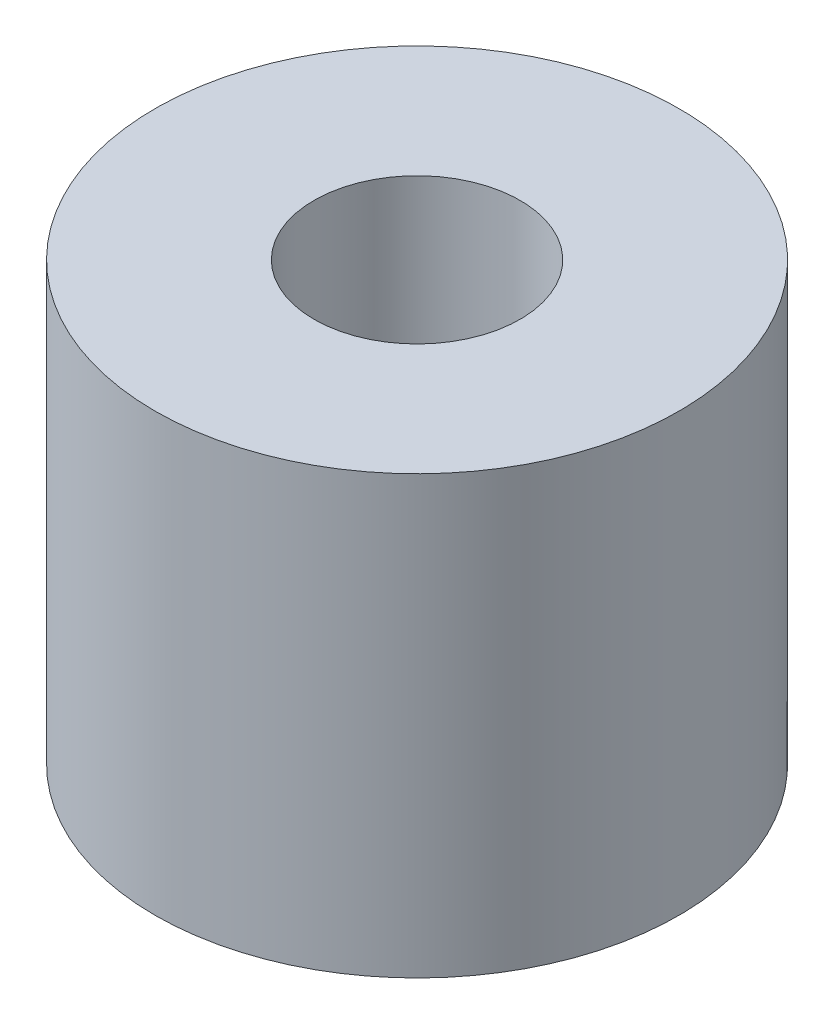
ISO-10303-21;
HEADER;
FILE_DESCRIPTION(('STEP AP214'),'2;1');
FILE_NAME('part.step','',(''),(''),'','','');
FILE_SCHEMA(('AUTOMOTIVE_DESIGN { 1 0 10303 214 1 1 1 1 }'));
ENDSEC;
DATA;
#1=APPLICATION_CONTEXT('core data for automotive mechanical design processes');
#2=APPLICATION_PROTOCOL_DEFINITION('international standard','automotive_design',2000,#1);
#3=PRODUCT_CONTEXT('',#1,'mechanical');
#4=PRODUCT('Part','Part','',(#3));
#5=PRODUCT_RELATED_PRODUCT_CATEGORY('part','',(#4));
#6=PRODUCT_DEFINITION_FORMATION('','',#4);
#7=PRODUCT_DEFINITION_CONTEXT('part definition',#1,'design');
#8=PRODUCT_DEFINITION('design','',#6,#7);
#9=PRODUCT_DEFINITION_SHAPE('','',#8);
#10=(LENGTH_UNIT() NAMED_UNIT(*) SI_UNIT(.MILLI.,.METRE.));
#11=(NAMED_UNIT(*) PLANE_ANGLE_UNIT() SI_UNIT($,.RADIAN.));
#12=(NAMED_UNIT(*) SI_UNIT($,.STERADIAN.) SOLID_ANGLE_UNIT());
#13=UNCERTAINTY_MEASURE_WITH_UNIT(LENGTH_MEASURE(1.E-05),#10,'distance_accuracy_value','');
#14=(GEOMETRIC_REPRESENTATION_CONTEXT(3) GLOBAL_UNCERTAINTY_ASSIGNED_CONTEXT((#13)) GLOBAL_UNIT_ASSIGNED_CONTEXT((#10,
#11,#12)) REPRESENTATION_CONTEXT('',''));
#15=CARTESIAN_POINT('',(0.,0.,0.));
#16=DIRECTION('',(0.,0.,1.));
#17=DIRECTION('',(1.,0.,0.));
#18=AXIS2_PLACEMENT_3D('',#15,#16,#17);
#19=CARTESIAN_POINT('',(0.,25.,0.));
#20=DIRECTION('',(0.,1.,0.));
#21=DIRECTION('',(0.,0.,1.));
#22=AXIS2_PLACEMENT_3D('',#19,#20,#21);
#23=PLANE('',#22);
#24=CARTESIAN_POINT('',(0.,25.,0.));
#25=DIRECTION('',(0.,1.,0.));
#26=DIRECTION('',(0.,0.,1.));
#27=AXIS2_PLACEMENT_3D('',#24,#25,#26);
#28=CIRCLE('',#27,5.89999999999999);
#29=CARTESIAN_POINT('',(0.,25.,5.89999999999999));
#30=VERTEX_POINT('',#29);
#31=EDGE_CURVE('E60',#30,#30,#28,.T.);
#32=ORIENTED_EDGE('',*,*,#31,.F.);
#33=EDGE_LOOP('',(#32));
#34=FACE_BOUND('',#33,.T.);
#35=CARTESIAN_POINT('',(0.,25.,0.));
#36=DIRECTION('',(0.,1.,0.));
#37=DIRECTION('',(0.,0.,1.));
#38=AXIS2_PLACEMENT_3D('',#35,#36,#37);
#39=CIRCLE('',#38,15.);
#40=CARTESIAN_POINT('',(0.,25.,15.));
#41=VERTEX_POINT('',#40);
#42=EDGE_CURVE('E10',#41,#41,#39,.T.);
#43=ORIENTED_EDGE('',*,*,#42,.T.);
#44=EDGE_LOOP('',(#43));
#45=FACE_BOUND('',#44,.T.);
#46=ADVANCED_FACE('F40',(#34,#45),#23,.T.);
#47=CARTESIAN_POINT('',(0.,0.,0.));
#48=DIRECTION('',(0.,1.,0.));
#49=DIRECTION('',(0.,0.,1.));
#50=AXIS2_PLACEMENT_3D('',#47,#48,#49);
#51=PLANE('',#50);
#52=CARTESIAN_POINT('',(0.,0.,0.));
#53=DIRECTION('',(0.,1.,0.));
#54=DIRECTION('',(0.,0.,1.));
#55=AXIS2_PLACEMENT_3D('',#52,#53,#54);
#56=CIRCLE('',#55,15.);
#57=CARTESIAN_POINT('',(0.,0.,15.));
#58=VERTEX_POINT('',#57);
#59=EDGE_CURVE('E48',#58,#58,#56,.T.);
#60=ORIENTED_EDGE('',*,*,#59,.F.);
#61=EDGE_LOOP('',(#60));
#62=FACE_BOUND('',#61,.T.);
#63=CARTESIAN_POINT('',(0.,0.,0.));
#64=DIRECTION('',(0.,1.,0.));
#65=DIRECTION('',(0.,0.,1.));
#66=AXIS2_PLACEMENT_3D('',#63,#64,#65);
#67=CIRCLE('',#66,2.5);
#68=CARTESIAN_POINT('',(0.,0.,2.5));
#69=VERTEX_POINT('',#68);
#70=EDGE_CURVE('E53',#69,#69,#67,.T.);
#71=ORIENTED_EDGE('',*,*,#70,.T.);
#72=EDGE_LOOP('',(#71));
#73=FACE_BOUND('',#72,.T.);
#74=ADVANCED_FACE('F67',(#62,#73),#51,.F.);
#75=CARTESIAN_POINT('',(0.,25.,0.));
#76=DIRECTION('',(0.,-1.,0.));
#77=DIRECTION('',(0.,0.,-1.));
#78=AXIS2_PLACEMENT_3D('',#75,#76,#77);
#79=CYLINDRICAL_SURFACE('',#78,15.);
#80=ORIENTED_EDGE('',*,*,#42,.F.);
#81=EDGE_LOOP('',(#80));
#82=FACE_BOUND('',#81,.T.);
#83=ORIENTED_EDGE('',*,*,#59,.T.);
#84=EDGE_LOOP('',(#83));
#85=FACE_BOUND('',#84,.T.);
#86=ADVANCED_FACE('F42',(#82,#85),#79,.T.);
#87=CARTESIAN_POINT('',(0.,25.,0.));
#88=DIRECTION('',(0.,-1.,0.));
#89=DIRECTION('',(0.,0.,-1.));
#90=AXIS2_PLACEMENT_3D('',#87,#88,#89);
#91=CYLINDRICAL_SURFACE('',#90,2.5);
#92=CARTESIAN_POINT('',(0.,7.9570738953063,0.));
#93=DIRECTION('',(0.,1.,0.));
#94=DIRECTION('',(0.,0.,1.));
#95=AXIS2_PLACEMENT_3D('',#92,#93,#94);
#96=CIRCLE('',#95,2.5);
#97=CARTESIAN_POINT('',(0.,7.9570738953063,2.5));
#98=VERTEX_POINT('',#97);
#99=EDGE_CURVE('E44',#98,#98,#96,.F.);
#100=ORIENTED_EDGE('',*,*,#99,.F.);
#101=EDGE_LOOP('',(#100));
#102=FACE_BOUND('',#101,.T.);
#103=ORIENTED_EDGE('',*,*,#70,.F.);
#104=EDGE_LOOP('',(#103));
#105=FACE_BOUND('',#104,.T.);
#106=ADVANCED_FACE('F74',(#102,#105),#91,.F.);
#107=CARTESIAN_POINT('',(0.,10.,0.));
#108=DIRECTION('',(0.,1.,0.));
#109=DIRECTION('',(0.,0.,1.));
#110=AXIS2_PLACEMENT_3D('',#107,#108,#109);
#111=CONICAL_SURFACE('',#110,5.9,1.02974425867665);
#112=ORIENTED_EDGE('',*,*,#99,.T.);
#113=EDGE_LOOP('',(#112));
#114=FACE_BOUND('',#113,.T.);
#115=CARTESIAN_POINT('',(0.,10.,0.));
#116=DIRECTION('',(0.,1.,0.));
#117=DIRECTION('',(0.,0.,1.));
#118=AXIS2_PLACEMENT_3D('',#115,#116,#117);
#119=CIRCLE('',#118,5.9);
#120=CARTESIAN_POINT('',(0.,10.,5.9));
#121=VERTEX_POINT('',#120);
#122=EDGE_CURVE('E57',#121,#121,#119,.T.);
#123=ORIENTED_EDGE('',*,*,#122,.T.);
#124=EDGE_LOOP('',(#123));
#125=FACE_BOUND('',#124,.T.);
#126=ADVANCED_FACE('F77',(#114,#125),#111,.F.);
#127=CARTESIAN_POINT('',(0.,25.,0.));
#128=DIRECTION('',(0.,1.,0.));
#129=DIRECTION('',(0.,0.,1.));
#130=AXIS2_PLACEMENT_3D('',#127,#128,#129);
#131=CYLINDRICAL_SURFACE('',#130,5.89999999999999);
#132=ORIENTED_EDGE('',*,*,#122,.F.);
#133=EDGE_LOOP('',(#132));
#134=FACE_BOUND('',#133,.T.);
#135=ORIENTED_EDGE('',*,*,#31,.T.);
#136=EDGE_LOOP('',(#135));
#137=FACE_BOUND('',#136,.T.);
#138=ADVANCED_FACE('F64',(#134,#137),#131,.F.);
#139=CLOSED_SHELL('',(#46,#74,#86,#106,#126,#138));
#140=MANIFOLD_SOLID_BREP('B2',#139);
#141=ADVANCED_BREP_SHAPE_REPRESENTATION('',(#18,#140),#14);
#142=SHAPE_DEFINITION_REPRESENTATION(#9,#141);
ENDSEC;
END-ISO-10303-21;
